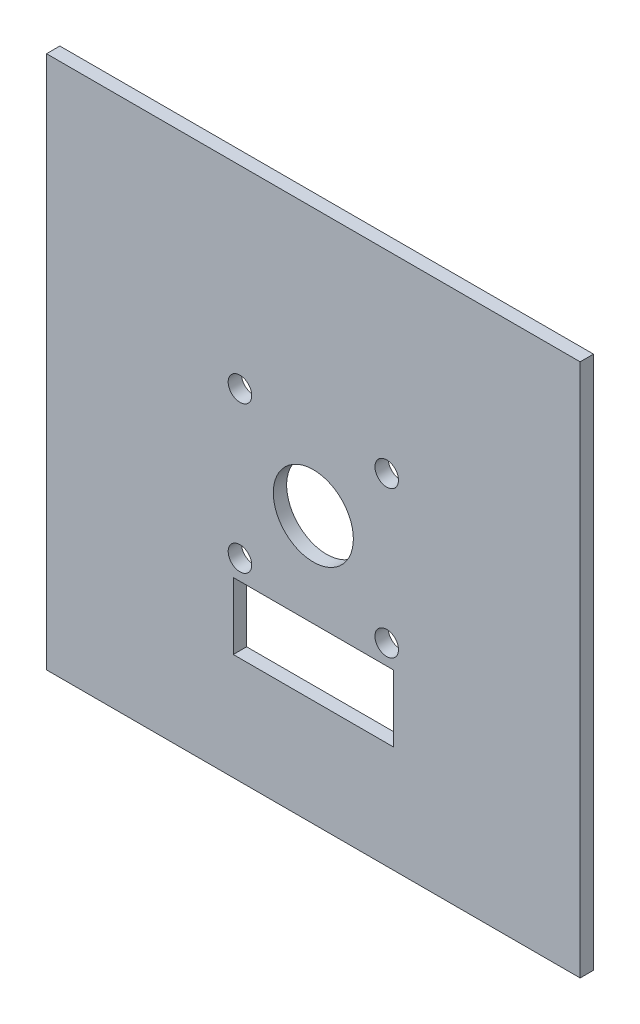
ISO-10303-21;
HEADER;
FILE_DESCRIPTION(('STEP AP214'),'2;1');
FILE_NAME('part.step','',(''),(''),'','','');
FILE_SCHEMA(('AUTOMOTIVE_DESIGN { 1 0 10303 214 1 1 1 1 }'));
ENDSEC;
DATA;
#1=APPLICATION_CONTEXT('core data for automotive mechanical design processes');
#2=APPLICATION_PROTOCOL_DEFINITION('international standard','automotive_design',2000,#1);
#3=PRODUCT_CONTEXT('',#1,'mechanical');
#4=PRODUCT('Part','Part','',(#3));
#5=PRODUCT_RELATED_PRODUCT_CATEGORY('part','',(#4));
#6=PRODUCT_DEFINITION_FORMATION('','',#4);
#7=PRODUCT_DEFINITION_CONTEXT('part definition',#1,'design');
#8=PRODUCT_DEFINITION('design','',#6,#7);
#9=PRODUCT_DEFINITION_SHAPE('','',#8);
#10=(LENGTH_UNIT() NAMED_UNIT(*) SI_UNIT(.MILLI.,.METRE.));
#11=(NAMED_UNIT(*) PLANE_ANGLE_UNIT() SI_UNIT($,.RADIAN.));
#12=(NAMED_UNIT(*) SI_UNIT($,.STERADIAN.) SOLID_ANGLE_UNIT());
#13=UNCERTAINTY_MEASURE_WITH_UNIT(LENGTH_MEASURE(1.E-05),#10,'distance_accuracy_value','');
#14=(GEOMETRIC_REPRESENTATION_CONTEXT(3) GLOBAL_UNCERTAINTY_ASSIGNED_CONTEXT((#13)) GLOBAL_UNIT_ASSIGNED_CONTEXT((#10,
#11,#12)) REPRESENTATION_CONTEXT('',''));
#15=CARTESIAN_POINT('',(0.,0.,0.));
#16=DIRECTION('',(0.,0.,1.));
#17=DIRECTION('',(1.,0.,0.));
#18=AXIS2_PLACEMENT_3D('',#15,#16,#17);
#19=CARTESIAN_POINT('',(0.,-127.,3.175));
#20=DIRECTION('',(0.,1.,0.));
#21=DIRECTION('',(0.,0.,1.));
#22=AXIS2_PLACEMENT_3D('',#19,#20,#21);
#23=PLANE('',#22);
#24=DIRECTION('',(1.,0.,0.));
#25=VECTOR('',#24,1.);
#26=CARTESIAN_POINT('',(0.,-127.,-3.175));
#27=LINE('',#26,#25);
#28=CARTESIAN_POINT('',(-127.,-127.,-3.175));
#29=VERTEX_POINT('',#28);
#30=CARTESIAN_POINT('',(127.,-127.,-3.175));
#31=VERTEX_POINT('',#30);
#32=EDGE_CURVE('E159',#29,#31,#27,.T.);
#33=ORIENTED_EDGE('',*,*,#32,.T.);
#34=DIRECTION('',(0.,0.,-1.));
#35=VECTOR('',#34,1.);
#36=CARTESIAN_POINT('',(127.,-127.,3.175));
#37=LINE('',#36,#35);
#38=CARTESIAN_POINT('',(127.,-127.,3.175));
#39=VERTEX_POINT('',#38);
#40=EDGE_CURVE('E11',#39,#31,#37,.T.);
#41=ORIENTED_EDGE('',*,*,#40,.F.);
#42=DIRECTION('',(1.,0.,0.));
#43=VECTOR('',#42,1.);
#44=CARTESIAN_POINT('',(0.,-127.,3.175));
#45=LINE('',#44,#43);
#46=CARTESIAN_POINT('',(-127.,-127.,3.175));
#47=VERTEX_POINT('',#46);
#48=EDGE_CURVE('E115',#47,#39,#45,.T.);
#49=ORIENTED_EDGE('',*,*,#48,.F.);
#50=DIRECTION('',(0.,0.,-1.));
#51=VECTOR('',#50,1.);
#52=CARTESIAN_POINT('',(-127.,-127.,3.175));
#53=LINE('',#52,#51);
#54=EDGE_CURVE('E54',#47,#29,#53,.T.);
#55=ORIENTED_EDGE('',*,*,#54,.T.);
#56=EDGE_LOOP('',(#33,#41,#49,#55));
#57=FACE_BOUND('',#56,.T.);
#58=ADVANCED_FACE('F35',(#57),#23,.F.);
#59=CARTESIAN_POINT('',(127.,0.,3.175));
#60=DIRECTION('',(-1.,0.,0.));
#61=DIRECTION('',(0.,0.,1.));
#62=AXIS2_PLACEMENT_3D('',#59,#60,#61);
#63=PLANE('',#62);
#64=DIRECTION('',(0.,1.,0.));
#65=VECTOR('',#64,1.);
#66=CARTESIAN_POINT('',(127.,0.,-3.175));
#67=LINE('',#66,#65);
#68=CARTESIAN_POINT('',(127.,127.,-3.175));
#69=VERTEX_POINT('',#68);
#70=EDGE_CURVE('E121',#31,#69,#67,.T.);
#71=ORIENTED_EDGE('',*,*,#70,.T.);
#72=DIRECTION('',(0.,0.,-1.));
#73=VECTOR('',#72,1.);
#74=CARTESIAN_POINT('',(127.,127.,3.175));
#75=LINE('',#74,#73);
#76=CARTESIAN_POINT('',(127.,127.,3.175));
#77=VERTEX_POINT('',#76);
#78=EDGE_CURVE('E45',#77,#69,#75,.T.);
#79=ORIENTED_EDGE('',*,*,#78,.F.);
#80=DIRECTION('',(0.,1.,0.));
#81=VECTOR('',#80,1.);
#82=CARTESIAN_POINT('',(127.,0.,3.175));
#83=LINE('',#82,#81);
#84=EDGE_CURVE('E108',#39,#77,#83,.T.);
#85=ORIENTED_EDGE('',*,*,#84,.F.);
#86=ORIENTED_EDGE('',*,*,#40,.T.);
#87=EDGE_LOOP('',(#71,#79,#85,#86));
#88=FACE_BOUND('',#87,.T.);
#89=ADVANCED_FACE('F120',(#88),#63,.F.);
#90=CARTESIAN_POINT('',(0.,127.,3.175));
#91=DIRECTION('',(0.,1.,0.));
#92=DIRECTION('',(0.,0.,1.));
#93=AXIS2_PLACEMENT_3D('',#90,#91,#92);
#94=PLANE('',#93);
#95=DIRECTION('',(1.,0.,0.));
#96=VECTOR('',#95,1.);
#97=CARTESIAN_POINT('',(0.,127.,-3.175));
#98=LINE('',#97,#96);
#99=CARTESIAN_POINT('',(-127.,127.,-3.175));
#100=VERTEX_POINT('',#99);
#101=EDGE_CURVE('E162',#100,#69,#98,.T.);
#102=ORIENTED_EDGE('',*,*,#101,.F.);
#103=DIRECTION('',(0.,0.,-1.));
#104=VECTOR('',#103,1.);
#105=CARTESIAN_POINT('',(-127.,127.,3.175));
#106=LINE('',#105,#104);
#107=CARTESIAN_POINT('',(-127.,127.,3.175));
#108=VERTEX_POINT('',#107);
#109=EDGE_CURVE('E80',#108,#100,#106,.T.);
#110=ORIENTED_EDGE('',*,*,#109,.F.);
#111=DIRECTION('',(1.,0.,0.));
#112=VECTOR('',#111,1.);
#113=CARTESIAN_POINT('',(0.,127.,3.175));
#114=LINE('',#113,#112);
#115=EDGE_CURVE('E114',#108,#77,#114,.T.);
#116=ORIENTED_EDGE('',*,*,#115,.T.);
#117=ORIENTED_EDGE('',*,*,#78,.T.);
#118=EDGE_LOOP('',(#102,#110,#116,#117));
#119=FACE_BOUND('',#118,.T.);
#120=ADVANCED_FACE('F125',(#119),#94,.T.);
#121=CARTESIAN_POINT('',(38.1,0.,3.175));
#122=DIRECTION('',(-1.,0.,0.));
#123=DIRECTION('',(0.,0.,1.));
#124=AXIS2_PLACEMENT_3D('',#121,#122,#123);
#125=PLANE('',#124);
#126=DIRECTION('',(0.,1.,0.));
#127=VECTOR('',#126,1.);
#128=CARTESIAN_POINT('',(38.1,0.,-3.175));
#129=LINE('',#128,#127);
#130=CARTESIAN_POINT('',(38.1,-76.2,-3.175));
#131=VERTEX_POINT('',#130);
#132=CARTESIAN_POINT('',(38.1,-44.45,-3.175));
#133=VERTEX_POINT('',#132);
#134=EDGE_CURVE('E147',#131,#133,#129,.T.);
#135=ORIENTED_EDGE('',*,*,#134,.F.);
#136=DIRECTION('',(0.,0.,-1.));
#137=VECTOR('',#136,1.);
#138=CARTESIAN_POINT('',(38.1,-76.2,3.175));
#139=LINE('',#138,#137);
#140=CARTESIAN_POINT('',(38.1,-76.2,3.175));
#141=VERTEX_POINT('',#140);
#142=EDGE_CURVE('E39',#141,#131,#139,.T.);
#143=ORIENTED_EDGE('',*,*,#142,.F.);
#144=DIRECTION('',(0.,1.,0.));
#145=VECTOR('',#144,1.);
#146=CARTESIAN_POINT('',(38.1,0.,3.175));
#147=LINE('',#146,#145);
#148=CARTESIAN_POINT('',(38.1,-44.45,3.175));
#149=VERTEX_POINT('',#148);
#150=EDGE_CURVE('E204',#141,#149,#147,.T.);
#151=ORIENTED_EDGE('',*,*,#150,.T.);
#152=DIRECTION('',(0.,0.,-1.));
#153=VECTOR('',#152,1.);
#154=CARTESIAN_POINT('',(38.1,-44.45,3.175));
#155=LINE('',#154,#153);
#156=EDGE_CURVE('E137',#149,#133,#155,.T.);
#157=ORIENTED_EDGE('',*,*,#156,.T.);
#158=EDGE_LOOP('',(#135,#143,#151,#157));
#159=FACE_BOUND('',#158,.T.);
#160=ADVANCED_FACE('F189',(#159),#125,.T.);
#161=CARTESIAN_POINT('',(0.,-76.2,3.175));
#162=DIRECTION('',(0.,1.,0.));
#163=DIRECTION('',(0.,0.,1.));
#164=AXIS2_PLACEMENT_3D('',#161,#162,#163);
#165=PLANE('',#164);
#166=DIRECTION('',(1.,0.,0.));
#167=VECTOR('',#166,1.);
#168=CARTESIAN_POINT('',(0.,-76.2,-3.175));
#169=LINE('',#168,#167);
#170=CARTESIAN_POINT('',(-38.1,-76.2,-3.175));
#171=VERTEX_POINT('',#170);
#172=EDGE_CURVE('E150',#171,#131,#169,.T.);
#173=ORIENTED_EDGE('',*,*,#172,.F.);
#174=DIRECTION('',(0.,0.,-1.));
#175=VECTOR('',#174,1.);
#176=CARTESIAN_POINT('',(-38.1,-76.2,3.175));
#177=LINE('',#176,#175);
#178=CARTESIAN_POINT('',(-38.1,-76.2,3.175));
#179=VERTEX_POINT('',#178);
#180=EDGE_CURVE('E179',#179,#171,#177,.T.);
#181=ORIENTED_EDGE('',*,*,#180,.F.);
#182=DIRECTION('',(1.,0.,0.));
#183=VECTOR('',#182,1.);
#184=CARTESIAN_POINT('',(0.,-76.2,3.175));
#185=LINE('',#184,#183);
#186=EDGE_CURVE('E188',#179,#141,#185,.T.);
#187=ORIENTED_EDGE('',*,*,#186,.T.);
#188=ORIENTED_EDGE('',*,*,#142,.T.);
#189=EDGE_LOOP('',(#173,#181,#187,#188));
#190=FACE_BOUND('',#189,.T.);
#191=ADVANCED_FACE('F186',(#190),#165,.T.);
#192=CARTESIAN_POINT('',(-38.1,0.,3.175));
#193=DIRECTION('',(-1.,0.,0.));
#194=DIRECTION('',(0.,0.,1.));
#195=AXIS2_PLACEMENT_3D('',#192,#193,#194);
#196=PLANE('',#195);
#197=DIRECTION('',(0.,1.,0.));
#198=VECTOR('',#197,1.);
#199=CARTESIAN_POINT('',(-38.1,0.,-3.175));
#200=LINE('',#199,#198);
#201=CARTESIAN_POINT('',(-38.1,-44.45,-3.175));
#202=VERTEX_POINT('',#201);
#203=EDGE_CURVE('E153',#171,#202,#200,.T.);
#204=ORIENTED_EDGE('',*,*,#203,.T.);
#205=DIRECTION('',(0.,0.,-1.));
#206=VECTOR('',#205,1.);
#207=CARTESIAN_POINT('',(-38.1,-44.45,3.175));
#208=LINE('',#207,#206);
#209=CARTESIAN_POINT('',(-38.1,-44.45,3.175));
#210=VERTEX_POINT('',#209);
#211=EDGE_CURVE('E177',#210,#202,#208,.T.);
#212=ORIENTED_EDGE('',*,*,#211,.F.);
#213=DIRECTION('',(0.,1.,0.));
#214=VECTOR('',#213,1.);
#215=CARTESIAN_POINT('',(-38.1,0.,3.175));
#216=LINE('',#215,#214);
#217=EDGE_CURVE('E197',#179,#210,#216,.T.);
#218=ORIENTED_EDGE('',*,*,#217,.F.);
#219=ORIENTED_EDGE('',*,*,#180,.T.);
#220=EDGE_LOOP('',(#204,#212,#218,#219));
#221=FACE_BOUND('',#220,.T.);
#222=ADVANCED_FACE('F195',(#221),#196,.F.);
#223=CARTESIAN_POINT('',(34.9249999999998,-34.9250000000002,3.175));
#224=DIRECTION('',(0.,0.,-1.));
#225=DIRECTION('',(-1.,0.,0.));
#226=AXIS2_PLACEMENT_3D('',#223,#224,#225);
#227=CYLINDRICAL_SURFACE('',#226,5.60309347545686);
#228=CARTESIAN_POINT('',(34.9249999999998,-34.9250000000002,3.175));
#229=DIRECTION('',(0.,0.,1.));
#230=DIRECTION('',(1.,0.,0.));
#231=AXIS2_PLACEMENT_3D('',#228,#229,#230);
#232=CIRCLE('',#231,5.60309347545686);
#233=CARTESIAN_POINT('',(40.5280934754566,-34.9250000000002,3.175));
#234=VERTEX_POINT('',#233);
#235=EDGE_CURVE('E128',#234,#234,#232,.T.);
#236=ORIENTED_EDGE('',*,*,#235,.T.);
#237=EDGE_LOOP('',(#236));
#238=FACE_BOUND('',#237,.T.);
#239=CARTESIAN_POINT('',(34.9249999999998,-34.9250000000002,-3.175));
#240=DIRECTION('',(0.,0.,1.));
#241=DIRECTION('',(1.,0.,0.));
#242=AXIS2_PLACEMENT_3D('',#239,#240,#241);
#243=CIRCLE('',#242,5.60309347545686);
#244=CARTESIAN_POINT('',(40.5280934754566,-34.9250000000002,-3.175));
#245=VERTEX_POINT('',#244);
#246=EDGE_CURVE('E167',#245,#245,#243,.T.);
#247=ORIENTED_EDGE('',*,*,#246,.F.);
#248=EDGE_LOOP('',(#247));
#249=FACE_BOUND('',#248,.T.);
#250=ADVANCED_FACE('F254',(#238,#249),#227,.F.);
#251=CARTESIAN_POINT('',(-127.,0.,3.175));
#252=DIRECTION('',(-1.,0.,0.));
#253=DIRECTION('',(0.,0.,1.));
#254=AXIS2_PLACEMENT_3D('',#251,#252,#253);
#255=PLANE('',#254);
#256=DIRECTION('',(0.,1.,0.));
#257=VECTOR('',#256,1.);
#258=CARTESIAN_POINT('',(-127.,0.,-3.175));
#259=LINE('',#258,#257);
#260=EDGE_CURVE('E164',#29,#100,#259,.T.);
#261=ORIENTED_EDGE('',*,*,#260,.F.);
#262=ORIENTED_EDGE('',*,*,#54,.F.);
#263=DIRECTION('',(0.,1.,0.));
#264=VECTOR('',#263,1.);
#265=CARTESIAN_POINT('',(-127.,0.,3.175));
#266=LINE('',#265,#264);
#267=EDGE_CURVE('E126',#47,#108,#266,.T.);
#268=ORIENTED_EDGE('',*,*,#267,.T.);
#269=ORIENTED_EDGE('',*,*,#109,.T.);
#270=EDGE_LOOP('',(#261,#262,#268,#269));
#271=FACE_BOUND('',#270,.T.);
#272=ADVANCED_FACE('F241',(#271),#255,.T.);
#273=CARTESIAN_POINT('',(0.,-44.45,3.175));
#274=DIRECTION('',(0.,1.,0.));
#275=DIRECTION('',(0.,0.,1.));
#276=AXIS2_PLACEMENT_3D('',#273,#274,#275);
#277=PLANE('',#276);
#278=DIRECTION('',(1.,0.,0.));
#279=VECTOR('',#278,1.);
#280=CARTESIAN_POINT('',(0.,-44.45,-3.175));
#281=LINE('',#280,#279);
#282=EDGE_CURVE('E156',#202,#133,#281,.T.);
#283=ORIENTED_EDGE('',*,*,#282,.T.);
#284=ORIENTED_EDGE('',*,*,#156,.F.);
#285=DIRECTION('',(1.,0.,0.));
#286=VECTOR('',#285,1.);
#287=CARTESIAN_POINT('',(0.,-44.45,3.175));
#288=LINE('',#287,#286);
#289=EDGE_CURVE('E200',#210,#149,#288,.T.);
#290=ORIENTED_EDGE('',*,*,#289,.F.);
#291=ORIENTED_EDGE('',*,*,#211,.T.);
#292=EDGE_LOOP('',(#283,#284,#290,#291));
#293=FACE_BOUND('',#292,.T.);
#294=ADVANCED_FACE('F199',(#293),#277,.F.);
#295=CARTESIAN_POINT('',(0.,0.,3.175));
#296=DIRECTION('',(0.,0.,-1.));
#297=DIRECTION('',(-1.,0.,0.));
#298=AXIS2_PLACEMENT_3D('',#295,#296,#297);
#299=CYLINDRICAL_SURFACE('',#298,19.05);
#300=CARTESIAN_POINT('',(0.,0.,3.175));
#301=DIRECTION('',(0.,0.,1.));
#302=DIRECTION('',(1.,0.,0.));
#303=AXIS2_PLACEMENT_3D('',#300,#301,#302);
#304=CIRCLE('',#303,19.05);
#305=CARTESIAN_POINT('',(19.05,0.,3.175));
#306=VERTEX_POINT('',#305);
#307=EDGE_CURVE('E208',#306,#306,#304,.T.);
#308=ORIENTED_EDGE('',*,*,#307,.T.);
#309=EDGE_LOOP('',(#308));
#310=FACE_BOUND('',#309,.T.);
#311=CARTESIAN_POINT('',(0.,0.,-3.175));
#312=DIRECTION('',(0.,0.,1.));
#313=DIRECTION('',(1.,0.,0.));
#314=AXIS2_PLACEMENT_3D('',#311,#312,#313);
#315=CIRCLE('',#314,19.05);
#316=CARTESIAN_POINT('',(19.05,0.,-3.175));
#317=VERTEX_POINT('',#316);
#318=EDGE_CURVE('E144',#317,#317,#315,.T.);
#319=ORIENTED_EDGE('',*,*,#318,.F.);
#320=EDGE_LOOP('',(#319));
#321=FACE_BOUND('',#320,.T.);
#322=ADVANCED_FACE('F232',(#310,#321),#299,.F.);
#323=CARTESIAN_POINT('',(-34.925,34.925,3.175));
#324=DIRECTION('',(0.,0.,-1.));
#325=DIRECTION('',(-1.,0.,0.));
#326=AXIS2_PLACEMENT_3D('',#323,#324,#325);
#327=CYLINDRICAL_SURFACE('',#326,5.60309347545684);
#328=CARTESIAN_POINT('',(-34.925,34.925,3.175));
#329=DIRECTION('',(0.,0.,1.));
#330=DIRECTION('',(1.,0.,0.));
#331=AXIS2_PLACEMENT_3D('',#328,#329,#330);
#332=CIRCLE('',#331,5.60309347545684);
#333=CARTESIAN_POINT('',(-29.3219065245432,34.925,3.175));
#334=VERTEX_POINT('',#333);
#335=EDGE_CURVE('E211',#334,#334,#332,.T.);
#336=ORIENTED_EDGE('',*,*,#335,.T.);
#337=EDGE_LOOP('',(#336));
#338=FACE_BOUND('',#337,.T.);
#339=CARTESIAN_POINT('',(-34.925,34.925,-3.175));
#340=DIRECTION('',(0.,0.,1.));
#341=DIRECTION('',(1.,0.,0.));
#342=AXIS2_PLACEMENT_3D('',#339,#340,#341);
#343=CIRCLE('',#342,5.60309347545684);
#344=CARTESIAN_POINT('',(-29.3219065245432,34.925,-3.175));
#345=VERTEX_POINT('',#344);
#346=EDGE_CURVE('E141',#345,#345,#343,.T.);
#347=ORIENTED_EDGE('',*,*,#346,.F.);
#348=EDGE_LOOP('',(#347));
#349=FACE_BOUND('',#348,.T.);
#350=ADVANCED_FACE('F222',(#338,#349),#327,.F.);
#351=CARTESIAN_POINT('',(34.9249999999998,34.9250000000002,3.175));
#352=DIRECTION('',(0.,0.,-1.));
#353=DIRECTION('',(-1.,0.,0.));
#354=AXIS2_PLACEMENT_3D('',#351,#352,#353);
#355=CYLINDRICAL_SURFACE('',#354,5.60309347545686);
#356=CARTESIAN_POINT('',(34.9249999999998,34.9250000000002,3.175));
#357=DIRECTION('',(0.,0.,1.));
#358=DIRECTION('',(1.,0.,0.));
#359=AXIS2_PLACEMENT_3D('',#356,#357,#358);
#360=CIRCLE('',#359,5.60309347545686);
#361=CARTESIAN_POINT('',(40.5280934754566,34.9250000000002,3.175));
#362=VERTEX_POINT('',#361);
#363=EDGE_CURVE('E173',#362,#362,#360,.F.);
#364=ORIENTED_EDGE('',*,*,#363,.F.);
#365=EDGE_LOOP('',(#364));
#366=FACE_BOUND('',#365,.T.);
#367=CARTESIAN_POINT('',(34.9249999999998,34.9250000000002,-3.175));
#368=DIRECTION('',(0.,0.,1.));
#369=DIRECTION('',(1.,0.,0.));
#370=AXIS2_PLACEMENT_3D('',#367,#368,#369);
#371=CIRCLE('',#370,5.60309347545686);
#372=CARTESIAN_POINT('',(40.5280934754566,34.9250000000002,-3.175));
#373=VERTEX_POINT('',#372);
#374=EDGE_CURVE('E138',#373,#373,#371,.F.);
#375=ORIENTED_EDGE('',*,*,#374,.T.);
#376=EDGE_LOOP('',(#375));
#377=FACE_BOUND('',#376,.T.);
#378=ADVANCED_FACE('F37',(#366,#377),#355,.F.);
#379=CARTESIAN_POINT('',(-34.925,-34.925,3.175));
#380=DIRECTION('',(0.,0.,-1.));
#381=DIRECTION('',(-1.,0.,0.));
#382=AXIS2_PLACEMENT_3D('',#379,#380,#381);
#383=CYLINDRICAL_SURFACE('',#382,5.60309347545684);
#384=CARTESIAN_POINT('',(-34.925,-34.925,3.175));
#385=DIRECTION('',(0.,0.,1.));
#386=DIRECTION('',(1.,0.,0.));
#387=AXIS2_PLACEMENT_3D('',#384,#385,#386);
#388=CIRCLE('',#387,5.60309347545684);
#389=CARTESIAN_POINT('',(-29.3219065245432,-34.925,3.175));
#390=VERTEX_POINT('',#389);
#391=EDGE_CURVE('E134',#390,#390,#388,.F.);
#392=ORIENTED_EDGE('',*,*,#391,.F.);
#393=EDGE_LOOP('',(#392));
#394=FACE_BOUND('',#393,.T.);
#395=CARTESIAN_POINT('',(-34.925,-34.925,-3.175));
#396=DIRECTION('',(0.,0.,1.));
#397=DIRECTION('',(1.,0.,0.));
#398=AXIS2_PLACEMENT_3D('',#395,#396,#397);
#399=CIRCLE('',#398,5.60309347545684);
#400=CARTESIAN_POINT('',(-29.3219065245432,-34.925,-3.175));
#401=VERTEX_POINT('',#400);
#402=EDGE_CURVE('E170',#401,#401,#399,.F.);
#403=ORIENTED_EDGE('',*,*,#402,.T.);
#404=EDGE_LOOP('',(#403));
#405=FACE_BOUND('',#404,.T.);
#406=ADVANCED_FACE('F221',(#394,#405),#383,.F.);
#407=CARTESIAN_POINT('',(0.,0.,3.175));
#408=DIRECTION('',(0.,0.,1.));
#409=DIRECTION('',(1.,0.,0.));
#410=AXIS2_PLACEMENT_3D('',#407,#408,#409);
#411=PLANE('',#410);
#412=ORIENTED_EDGE('',*,*,#363,.T.);
#413=EDGE_LOOP('',(#412));
#414=FACE_BOUND('',#413,.T.);
#415=ORIENTED_EDGE('',*,*,#335,.F.);
#416=EDGE_LOOP('',(#415));
#417=FACE_BOUND('',#416,.T.);
#418=ORIENTED_EDGE('',*,*,#307,.F.);
#419=EDGE_LOOP('',(#418));
#420=FACE_BOUND('',#419,.T.);
#421=ORIENTED_EDGE('',*,*,#150,.F.);
#422=ORIENTED_EDGE('',*,*,#186,.F.);
#423=ORIENTED_EDGE('',*,*,#217,.T.);
#424=ORIENTED_EDGE('',*,*,#289,.T.);
#425=EDGE_LOOP('',(#421,#422,#423,#424));
#426=FACE_BOUND('',#425,.T.);
#427=ORIENTED_EDGE('',*,*,#48,.T.);
#428=ORIENTED_EDGE('',*,*,#84,.T.);
#429=ORIENTED_EDGE('',*,*,#115,.F.);
#430=ORIENTED_EDGE('',*,*,#267,.F.);
#431=EDGE_LOOP('',(#427,#428,#429,#430));
#432=FACE_BOUND('',#431,.T.);
#433=ORIENTED_EDGE('',*,*,#235,.F.);
#434=EDGE_LOOP('',(#433));
#435=FACE_BOUND('',#434,.T.);
#436=ORIENTED_EDGE('',*,*,#391,.T.);
#437=EDGE_LOOP('',(#436));
#438=FACE_BOUND('',#437,.T.);
#439=ADVANCED_FACE('F110',(#414,#417,#420,#426,#432,#435,#438),#411,.T.);
#440=CARTESIAN_POINT('',(0.,0.,-3.175));
#441=DIRECTION('',(0.,0.,1.));
#442=DIRECTION('',(1.,0.,0.));
#443=AXIS2_PLACEMENT_3D('',#440,#441,#442);
#444=PLANE('',#443);
#445=ORIENTED_EDGE('',*,*,#374,.F.);
#446=EDGE_LOOP('',(#445));
#447=FACE_BOUND('',#446,.T.);
#448=ORIENTED_EDGE('',*,*,#346,.T.);
#449=EDGE_LOOP('',(#448));
#450=FACE_BOUND('',#449,.T.);
#451=ORIENTED_EDGE('',*,*,#318,.T.);
#452=EDGE_LOOP('',(#451));
#453=FACE_BOUND('',#452,.T.);
#454=ORIENTED_EDGE('',*,*,#134,.T.);
#455=ORIENTED_EDGE('',*,*,#282,.F.);
#456=ORIENTED_EDGE('',*,*,#203,.F.);
#457=ORIENTED_EDGE('',*,*,#172,.T.);
#458=EDGE_LOOP('',(#454,#455,#456,#457));
#459=FACE_BOUND('',#458,.T.);
#460=ORIENTED_EDGE('',*,*,#32,.F.);
#461=ORIENTED_EDGE('',*,*,#260,.T.);
#462=ORIENTED_EDGE('',*,*,#101,.T.);
#463=ORIENTED_EDGE('',*,*,#70,.F.);
#464=EDGE_LOOP('',(#460,#461,#462,#463));
#465=FACE_BOUND('',#464,.T.);
#466=ORIENTED_EDGE('',*,*,#246,.T.);
#467=EDGE_LOOP('',(#466));
#468=FACE_BOUND('',#467,.T.);
#469=ORIENTED_EDGE('',*,*,#402,.F.);
#470=EDGE_LOOP('',(#469));
#471=FACE_BOUND('',#470,.T.);
#472=ADVANCED_FACE('F192',(#447,#450,#453,#459,#465,#468,#471),#444,.F.);
#473=CLOSED_SHELL('',(#58,#89,#120,#160,#191,#222,#250,#272,#294,#322,#350,#378,#406,#439,#472));
#474=MANIFOLD_SOLID_BREP('B2',#473);
#475=ADVANCED_BREP_SHAPE_REPRESENTATION('',(#18,#474),#14);
#476=SHAPE_DEFINITION_REPRESENTATION(#9,#475);
ENDSEC;
END-ISO-10303-21;
